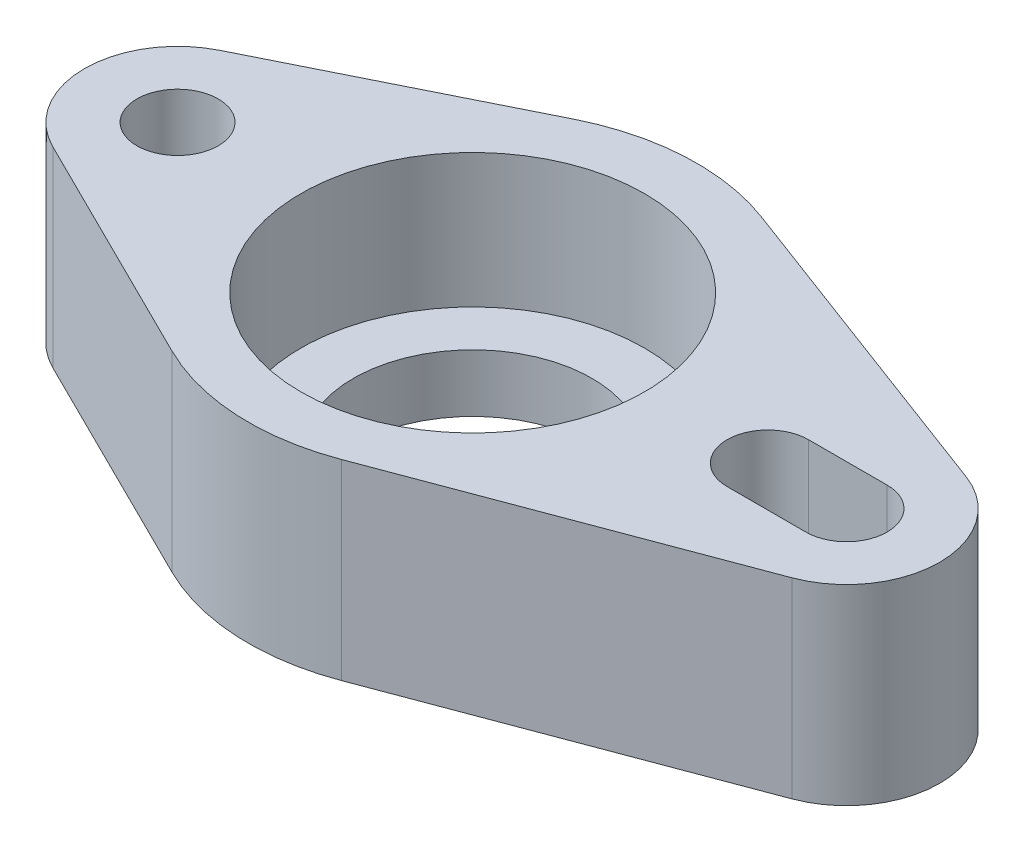
ISO-10303-21;
HEADER;
FILE_DESCRIPTION(('STEP AP214'),'2;1');
FILE_NAME('part.step','',(''),(''),'','','');
FILE_SCHEMA(('AUTOMOTIVE_DESIGN { 1 0 10303 214 1 1 1 1 }'));
ENDSEC;
DATA;
#1=APPLICATION_CONTEXT('core data for automotive mechanical design processes');
#2=APPLICATION_PROTOCOL_DEFINITION('international standard','automotive_design',2000,#1);
#3=PRODUCT_CONTEXT('',#1,'mechanical');
#4=PRODUCT('Part','Part','',(#3));
#5=PRODUCT_RELATED_PRODUCT_CATEGORY('part','',(#4));
#6=PRODUCT_DEFINITION_FORMATION('','',#4);
#7=PRODUCT_DEFINITION_CONTEXT('part definition',#1,'design');
#8=PRODUCT_DEFINITION('design','',#6,#7);
#9=PRODUCT_DEFINITION_SHAPE('','',#8);
#10=(LENGTH_UNIT() NAMED_UNIT(*) SI_UNIT(.MILLI.,.METRE.));
#11=(NAMED_UNIT(*) PLANE_ANGLE_UNIT() SI_UNIT($,.RADIAN.));
#12=(NAMED_UNIT(*) SI_UNIT($,.STERADIAN.) SOLID_ANGLE_UNIT());
#13=UNCERTAINTY_MEASURE_WITH_UNIT(LENGTH_MEASURE(1.E-05),#10,'distance_accuracy_value','');
#14=(GEOMETRIC_REPRESENTATION_CONTEXT(3) GLOBAL_UNCERTAINTY_ASSIGNED_CONTEXT((#13)) GLOBAL_UNIT_ASSIGNED_CONTEXT((#10,
#11,#12)) REPRESENTATION_CONTEXT('',''));
#15=CARTESIAN_POINT('',(0.,0.,0.));
#16=DIRECTION('',(0.,0.,1.));
#17=DIRECTION('',(1.,0.,0.));
#18=AXIS2_PLACEMENT_3D('',#15,#16,#17);
#19=CARTESIAN_POINT('',(3.,7.3,8.00640368704951));
#20=DIRECTION('',(0.350877192982456,0.,0.93642148386544));
#21=DIRECTION('',(0.93642148386544,0.,-0.350877192982456));
#22=AXIS2_PLACEMENT_3D('',#19,#20,#21);
#23=PLANE('',#22);
#24=DIRECTION('',(-0.93642148386544,0.,0.350877192982456));
#25=VECTOR('',#24,1.);
#26=CARTESIAN_POINT('',(3.,0.,8.00640368704951));
#27=LINE('',#26,#25);
#28=CARTESIAN_POINT('',(15.4956140350877,0.,3.32429626772231));
#29=VERTEX_POINT('',#28);
#30=CARTESIAN_POINT('',(3.,0.,8.00640368704951));
#31=VERTEX_POINT('',#30);
#32=EDGE_CURVE('E234',#29,#31,#27,.T.);
#33=ORIENTED_EDGE('',*,*,#32,.F.);
#34=DIRECTION('',(0.,-1.,0.));
#35=VECTOR('',#34,1.);
#36=CARTESIAN_POINT('',(15.4956140350877,7.3,3.32429626772231));
#37=LINE('',#36,#35);
#38=CARTESIAN_POINT('',(15.4956140350877,7.3,3.32429626772231));
#39=VERTEX_POINT('',#38);
#40=EDGE_CURVE('E55',#39,#29,#37,.T.);
#41=ORIENTED_EDGE('',*,*,#40,.F.);
#42=DIRECTION('',(-0.93642148386544,0.,0.350877192982456));
#43=VECTOR('',#42,1.);
#44=CARTESIAN_POINT('',(3.,7.3,8.00640368704951));
#45=LINE('',#44,#43);
#46=CARTESIAN_POINT('',(3.,7.3,8.00640368704951));
#47=VERTEX_POINT('',#46);
#48=EDGE_CURVE('E275',#39,#47,#45,.T.);
#49=ORIENTED_EDGE('',*,*,#48,.T.);
#50=DIRECTION('',(0.,-1.,0.));
#51=VECTOR('',#50,1.);
#52=CARTESIAN_POINT('',(3.,7.3,8.00640368704951));
#53=LINE('',#52,#51);
#54=EDGE_CURVE('E110',#47,#31,#53,.T.);
#55=ORIENTED_EDGE('',*,*,#54,.T.);
#56=EDGE_LOOP('',(#33,#41,#49,#55));
#57=FACE_BOUND('',#56,.T.);
#58=ADVANCED_FACE('F45',(#57),#23,.T.);
#59=CARTESIAN_POINT('',(14.25,7.3,0.));
#60=DIRECTION('',(0.,-1.,0.));
#61=DIRECTION('',(0.,0.,-1.));
#62=AXIS2_PLACEMENT_3D('',#59,#60,#61);
#63=CYLINDRICAL_SURFACE('',#62,3.55);
#64=CARTESIAN_POINT('',(14.25,0.,0.));
#65=DIRECTION('',(0.,1.,0.));
#66=DIRECTION('',(0.,0.,1.));
#67=AXIS2_PLACEMENT_3D('',#64,#65,#66);
#68=CIRCLE('',#67,3.55);
#69=CARTESIAN_POINT('',(15.4956140350877,0.,-3.32429626772231));
#70=VERTEX_POINT('',#69);
#71=EDGE_CURVE('E230',#29,#70,#68,.T.);
#72=ORIENTED_EDGE('',*,*,#71,.T.);
#73=DIRECTION('',(0.,-1.,0.));
#74=VECTOR('',#73,1.);
#75=CARTESIAN_POINT('',(15.4956140350877,7.3,-3.32429626772231));
#76=LINE('',#75,#74);
#77=CARTESIAN_POINT('',(15.4956140350877,7.3,-3.32429626772231));
#78=VERTEX_POINT('',#77);
#79=EDGE_CURVE('E185',#78,#70,#76,.T.);
#80=ORIENTED_EDGE('',*,*,#79,.F.);
#81=CARTESIAN_POINT('',(14.25,7.3,0.));
#82=DIRECTION('',(0.,1.,0.));
#83=DIRECTION('',(0.,0.,1.));
#84=AXIS2_PLACEMENT_3D('',#81,#82,#83);
#85=CIRCLE('',#84,3.55);
#86=EDGE_CURVE('E271',#39,#78,#85,.T.);
#87=ORIENTED_EDGE('',*,*,#86,.F.);
#88=ORIENTED_EDGE('',*,*,#40,.T.);
#89=EDGE_LOOP('',(#72,#80,#87,#88));
#90=FACE_BOUND('',#89,.T.);
#91=ADVANCED_FACE('F339',(#90),#63,.T.);
#92=CARTESIAN_POINT('',(3.,7.3,-8.00640368704951));
#93=DIRECTION('',(-0.350877192982456,0.,0.93642148386544));
#94=DIRECTION('',(0.93642148386544,0.,0.350877192982456));
#95=AXIS2_PLACEMENT_3D('',#92,#93,#94);
#96=PLANE('',#95);
#97=DIRECTION('',(-0.93642148386544,0.,-0.350877192982456));
#98=VECTOR('',#97,1.);
#99=CARTESIAN_POINT('',(3.,0.,-8.00640368704951));
#100=LINE('',#99,#98);
#101=CARTESIAN_POINT('',(3.,0.,-8.00640368704951));
#102=VERTEX_POINT('',#101);
#103=EDGE_CURVE('E226',#70,#102,#100,.T.);
#104=ORIENTED_EDGE('',*,*,#103,.T.);
#105=DIRECTION('',(0.,-1.,0.));
#106=VECTOR('',#105,1.);
#107=CARTESIAN_POINT('',(3.,7.3,-8.00640368704951));
#108=LINE('',#107,#106);
#109=CARTESIAN_POINT('',(3.,7.3,-8.00640368704951));
#110=VERTEX_POINT('',#109);
#111=EDGE_CURVE('E181',#110,#102,#108,.T.);
#112=ORIENTED_EDGE('',*,*,#111,.F.);
#113=DIRECTION('',(-0.93642148386544,0.,-0.350877192982456));
#114=VECTOR('',#113,1.);
#115=CARTESIAN_POINT('',(3.,7.3,-8.00640368704951));
#116=LINE('',#115,#114);
#117=EDGE_CURVE('E267',#78,#110,#116,.T.);
#118=ORIENTED_EDGE('',*,*,#117,.F.);
#119=ORIENTED_EDGE('',*,*,#79,.T.);
#120=EDGE_LOOP('',(#104,#112,#118,#119));
#121=FACE_BOUND('',#120,.T.);
#122=ADVANCED_FACE('F344',(#121),#96,.F.);
#123=CARTESIAN_POINT('',(0.,7.3,0.));
#124=DIRECTION('',(0.,-1.,0.));
#125=DIRECTION('',(0.,0.,-1.));
#126=AXIS2_PLACEMENT_3D('',#123,#124,#125);
#127=CYLINDRICAL_SURFACE('',#126,8.55);
#128=CARTESIAN_POINT('',(0.,0.,0.));
#129=DIRECTION('',(0.,1.,0.));
#130=DIRECTION('',(0.,0.,1.));
#131=AXIS2_PLACEMENT_3D('',#128,#129,#130);
#132=CIRCLE('',#131,8.55);
#133=CARTESIAN_POINT('',(-3.8,0.,-7.65914486088362));
#134=VERTEX_POINT('',#133);
#135=EDGE_CURVE('E222',#102,#134,#132,.T.);
#136=ORIENTED_EDGE('',*,*,#135,.T.);
#137=DIRECTION('',(0.,-1.,0.));
#138=VECTOR('',#137,1.);
#139=CARTESIAN_POINT('',(-3.8,7.3,-7.65914486088362));
#140=LINE('',#139,#138);
#141=CARTESIAN_POINT('',(-3.8,7.3,-7.65914486088362));
#142=VERTEX_POINT('',#141);
#143=EDGE_CURVE('E174',#142,#134,#140,.T.);
#144=ORIENTED_EDGE('',*,*,#143,.F.);
#145=CARTESIAN_POINT('',(0.,7.3,0.));
#146=DIRECTION('',(0.,1.,0.));
#147=DIRECTION('',(0.,0.,1.));
#148=AXIS2_PLACEMENT_3D('',#145,#146,#147);
#149=CIRCLE('',#148,8.55);
#150=EDGE_CURVE('E264',#110,#142,#149,.T.);
#151=ORIENTED_EDGE('',*,*,#150,.F.);
#152=ORIENTED_EDGE('',*,*,#111,.T.);
#153=EDGE_LOOP('',(#136,#144,#151,#152));
#154=FACE_BOUND('',#153,.T.);
#155=ADVANCED_FACE('F372',(#154),#127,.T.);
#156=CARTESIAN_POINT('',(-3.8,7.3,-7.65914486088362));
#157=DIRECTION('',(-0.444444444444444,0.,-0.895806416477617));
#158=DIRECTION('',(-0.895806416477617,0.,0.444444444444444));
#159=AXIS2_PLACEMENT_3D('',#156,#157,#158);
#160=PLANE('',#159);
#161=DIRECTION('',(0.895806416477617,0.,-0.444444444444444));
#162=VECTOR('',#161,1.);
#163=CARTESIAN_POINT('',(-3.8,0.,-7.65914486088362));
#164=LINE('',#163,#162);
#165=CARTESIAN_POINT('',(-12.8277777777778,0.,-3.18011277849554));
#166=VERTEX_POINT('',#165);
#167=EDGE_CURVE('E218',#166,#134,#164,.T.);
#168=ORIENTED_EDGE('',*,*,#167,.F.);
#169=DIRECTION('',(0.,-1.,0.));
#170=VECTOR('',#169,1.);
#171=CARTESIAN_POINT('',(-12.8277777777778,7.3,-3.18011277849554));
#172=LINE('',#171,#170);
#173=CARTESIAN_POINT('',(-12.8277777777778,7.3,-3.18011277849554));
#174=VERTEX_POINT('',#173);
#175=EDGE_CURVE('E170',#174,#166,#172,.T.);
#176=ORIENTED_EDGE('',*,*,#175,.F.);
#177=DIRECTION('',(0.895806416477617,0.,-0.444444444444444));
#178=VECTOR('',#177,1.);
#179=CARTESIAN_POINT('',(-3.8,7.3,-7.65914486088362));
#180=LINE('',#179,#178);
#181=EDGE_CURVE('E162',#174,#142,#180,.T.);
#182=ORIENTED_EDGE('',*,*,#181,.T.);
#183=ORIENTED_EDGE('',*,*,#143,.T.);
#184=EDGE_LOOP('',(#168,#176,#182,#183));
#185=FACE_BOUND('',#184,.T.);
#186=ADVANCED_FACE('F375',(#185),#160,.T.);
#187=CARTESIAN_POINT('',(-11.25,7.3,0.));
#188=DIRECTION('',(0.,-1.,0.));
#189=DIRECTION('',(0.,0.,-1.));
#190=AXIS2_PLACEMENT_3D('',#187,#188,#189);
#191=CYLINDRICAL_SURFACE('',#190,3.55);
#192=CARTESIAN_POINT('',(-11.25,0.,0.));
#193=DIRECTION('',(0.,1.,0.));
#194=DIRECTION('',(0.,0.,1.));
#195=AXIS2_PLACEMENT_3D('',#192,#193,#194);
#196=CIRCLE('',#195,3.55);
#197=CARTESIAN_POINT('',(-12.8277777777778,0.,3.18011277849554));
#198=VERTEX_POINT('',#197);
#199=EDGE_CURVE('E168',#166,#198,#196,.T.);
#200=ORIENTED_EDGE('',*,*,#199,.T.);
#201=DIRECTION('',(0.,-1.,0.));
#202=VECTOR('',#201,1.);
#203=CARTESIAN_POINT('',(-12.8277777777778,7.3,3.18011277849554));
#204=LINE('',#203,#202);
#205=CARTESIAN_POINT('',(-12.8277777777778,7.3,3.18011277849554));
#206=VERTEX_POINT('',#205);
#207=EDGE_CURVE('E151',#206,#198,#204,.T.);
#208=ORIENTED_EDGE('',*,*,#207,.F.);
#209=CARTESIAN_POINT('',(-11.25,7.3,0.));
#210=DIRECTION('',(0.,1.,0.));
#211=DIRECTION('',(0.,0.,1.));
#212=AXIS2_PLACEMENT_3D('',#209,#210,#211);
#213=CIRCLE('',#212,3.55);
#214=EDGE_CURVE('E155',#174,#206,#213,.T.);
#215=ORIENTED_EDGE('',*,*,#214,.F.);
#216=ORIENTED_EDGE('',*,*,#175,.T.);
#217=EDGE_LOOP('',(#200,#208,#215,#216));
#218=FACE_BOUND('',#217,.T.);
#219=ADVANCED_FACE('F166',(#218),#191,.T.);
#220=CARTESIAN_POINT('',(-3.8,7.3,7.65914486088362));
#221=DIRECTION('',(0.444444444444444,0.,-0.895806416477617));
#222=DIRECTION('',(-0.895806416477617,0.,-0.444444444444444));
#223=AXIS2_PLACEMENT_3D('',#220,#221,#222);
#224=PLANE('',#223);
#225=DIRECTION('',(0.895806416477617,0.,0.444444444444444));
#226=VECTOR('',#225,1.);
#227=CARTESIAN_POINT('',(-3.8,0.,7.65914486088362));
#228=LINE('',#227,#226);
#229=CARTESIAN_POINT('',(-3.8,0.,7.65914486088362));
#230=VERTEX_POINT('',#229);
#231=EDGE_CURVE('E213',#198,#230,#228,.T.);
#232=ORIENTED_EDGE('',*,*,#231,.T.);
#233=DIRECTION('',(0.,-1.,0.));
#234=VECTOR('',#233,1.);
#235=CARTESIAN_POINT('',(-3.8,7.3,7.65914486088362));
#236=LINE('',#235,#234);
#237=CARTESIAN_POINT('',(-3.8,7.3,7.65914486088362));
#238=VERTEX_POINT('',#237);
#239=EDGE_CURVE('E153',#238,#230,#236,.T.);
#240=ORIENTED_EDGE('',*,*,#239,.F.);
#241=DIRECTION('',(0.895806416477617,0.,0.444444444444444));
#242=VECTOR('',#241,1.);
#243=CARTESIAN_POINT('',(-3.8,7.3,7.65914486088362));
#244=LINE('',#243,#242);
#245=EDGE_CURVE('E146',#206,#238,#244,.T.);
#246=ORIENTED_EDGE('',*,*,#245,.F.);
#247=ORIENTED_EDGE('',*,*,#207,.T.);
#248=EDGE_LOOP('',(#232,#240,#246,#247));
#249=FACE_BOUND('',#248,.T.);
#250=ADVANCED_FACE('F149',(#249),#224,.F.);
#251=CARTESIAN_POINT('',(11.25,7.3,0.));
#252=DIRECTION('',(0.,-1.,0.));
#253=DIRECTION('',(0.,0.,-1.));
#254=AXIS2_PLACEMENT_3D('',#251,#252,#253);
#255=CYLINDRICAL_SURFACE('',#254,1.55);
#256=CARTESIAN_POINT('',(11.25,0.,0.));
#257=DIRECTION('',(0.,1.,0.));
#258=DIRECTION('',(0.,0.,1.));
#259=AXIS2_PLACEMENT_3D('',#256,#257,#258);
#260=CIRCLE('',#259,1.55);
#261=CARTESIAN_POINT('',(11.25,0.,-1.55));
#262=VERTEX_POINT('',#261);
#263=CARTESIAN_POINT('',(11.25,0.,1.55));
#264=VERTEX_POINT('',#263);
#265=EDGE_CURVE('E248',#262,#264,#260,.T.);
#266=ORIENTED_EDGE('',*,*,#265,.F.);
#267=DIRECTION('',(0.,-1.,0.));
#268=VECTOR('',#267,1.);
#269=CARTESIAN_POINT('',(11.25,7.3,-1.55));
#270=LINE('',#269,#268);
#271=CARTESIAN_POINT('',(11.25,7.3,-1.55));
#272=VERTEX_POINT('',#271);
#273=EDGE_CURVE('E117',#272,#262,#270,.T.);
#274=ORIENTED_EDGE('',*,*,#273,.F.);
#275=CARTESIAN_POINT('',(11.25,7.3,0.));
#276=DIRECTION('',(0.,1.,0.));
#277=DIRECTION('',(0.,0.,1.));
#278=AXIS2_PLACEMENT_3D('',#275,#276,#277);
#279=CIRCLE('',#278,1.55);
#280=CARTESIAN_POINT('',(11.25,7.3,1.55));
#281=VERTEX_POINT('',#280);
#282=EDGE_CURVE('E210',#272,#281,#279,.T.);
#283=ORIENTED_EDGE('',*,*,#282,.T.);
#284=DIRECTION('',(0.,-1.,0.));
#285=VECTOR('',#284,1.);
#286=CARTESIAN_POINT('',(11.25,7.3,1.55));
#287=LINE('',#286,#285);
#288=EDGE_CURVE('E191',#281,#264,#287,.T.);
#289=ORIENTED_EDGE('',*,*,#288,.T.);
#290=EDGE_LOOP('',(#266,#274,#283,#289));
#291=FACE_BOUND('',#290,.T.);
#292=ADVANCED_FACE('F47',(#291),#255,.F.);
#293=CARTESIAN_POINT('',(0.,7.3,-1.55));
#294=DIRECTION('',(0.,0.,-1.));
#295=DIRECTION('',(-1.,0.,0.));
#296=AXIS2_PLACEMENT_3D('',#293,#294,#295);
#297=PLANE('',#296);
#298=DIRECTION('',(1.,0.,0.));
#299=VECTOR('',#298,1.);
#300=CARTESIAN_POINT('',(0.,0.,-1.55));
#301=LINE('',#300,#299);
#302=CARTESIAN_POINT('',(14.25,0.,-1.55));
#303=VERTEX_POINT('',#302);
#304=EDGE_CURVE('E245',#262,#303,#301,.T.);
#305=ORIENTED_EDGE('',*,*,#304,.T.);
#306=DIRECTION('',(0.,-1.,0.));
#307=VECTOR('',#306,1.);
#308=CARTESIAN_POINT('',(14.25,7.3,-1.55));
#309=LINE('',#308,#307);
#310=CARTESIAN_POINT('',(14.25,7.3,-1.55));
#311=VERTEX_POINT('',#310);
#312=EDGE_CURVE('E198',#311,#303,#309,.T.);
#313=ORIENTED_EDGE('',*,*,#312,.F.);
#314=DIRECTION('',(1.,0.,0.));
#315=VECTOR('',#314,1.);
#316=CARTESIAN_POINT('',(0.,7.3,-1.55));
#317=LINE('',#316,#315);
#318=EDGE_CURVE('E286',#272,#311,#317,.T.);
#319=ORIENTED_EDGE('',*,*,#318,.F.);
#320=ORIENTED_EDGE('',*,*,#273,.T.);
#321=EDGE_LOOP('',(#305,#313,#319,#320));
#322=FACE_BOUND('',#321,.T.);
#323=ADVANCED_FACE('F353',(#322),#297,.F.);
#324=CARTESIAN_POINT('',(14.25,7.3,0.));
#325=DIRECTION('',(0.,-1.,0.));
#326=DIRECTION('',(0.,0.,-1.));
#327=AXIS2_PLACEMENT_3D('',#324,#325,#326);
#328=CYLINDRICAL_SURFACE('',#327,1.55);
#329=CARTESIAN_POINT('',(14.25,0.,0.));
#330=DIRECTION('',(0.,1.,0.));
#331=DIRECTION('',(0.,0.,1.));
#332=AXIS2_PLACEMENT_3D('',#329,#330,#331);
#333=CIRCLE('',#332,1.55);
#334=CARTESIAN_POINT('',(14.25,0.,1.55));
#335=VERTEX_POINT('',#334);
#336=EDGE_CURVE('E241',#335,#303,#333,.T.);
#337=ORIENTED_EDGE('',*,*,#336,.F.);
#338=DIRECTION('',(0.,-1.,0.));
#339=VECTOR('',#338,1.);
#340=CARTESIAN_POINT('',(14.25,7.3,1.55));
#341=LINE('',#340,#339);
#342=CARTESIAN_POINT('',(14.25,7.3,1.55));
#343=VERTEX_POINT('',#342);
#344=EDGE_CURVE('E194',#343,#335,#341,.T.);
#345=ORIENTED_EDGE('',*,*,#344,.F.);
#346=CARTESIAN_POINT('',(14.25,7.3,0.));
#347=DIRECTION('',(0.,1.,0.));
#348=DIRECTION('',(0.,0.,1.));
#349=AXIS2_PLACEMENT_3D('',#346,#347,#348);
#350=CIRCLE('',#349,1.55);
#351=EDGE_CURVE('E282',#343,#311,#350,.T.);
#352=ORIENTED_EDGE('',*,*,#351,.T.);
#353=ORIENTED_EDGE('',*,*,#312,.T.);
#354=EDGE_LOOP('',(#337,#345,#352,#353));
#355=FACE_BOUND('',#354,.T.);
#356=ADVANCED_FACE('F312',(#355),#328,.F.);
#357=CARTESIAN_POINT('',(0.,7.3,0.));
#358=DIRECTION('',(0.,-1.,0.));
#359=DIRECTION('',(0.,0.,-1.));
#360=AXIS2_PLACEMENT_3D('',#357,#358,#359);
#361=CYLINDRICAL_SURFACE('',#360,6.55);
#362=CARTESIAN_POINT('',(0.,2.2,0.));
#363=DIRECTION('',(0.,1.,0.));
#364=DIRECTION('',(0.,0.,1.));
#365=AXIS2_PLACEMENT_3D('',#362,#363,#364);
#366=CIRCLE('',#365,6.55);
#367=CARTESIAN_POINT('',(0.,2.2,6.55));
#368=VERTEX_POINT('',#367);
#369=EDGE_CURVE('E11',#368,#368,#366,.T.);
#370=ORIENTED_EDGE('',*,*,#369,.F.);
#371=EDGE_LOOP('',(#370));
#372=FACE_BOUND('',#371,.T.);
#373=CARTESIAN_POINT('',(0.,7.3,0.));
#374=DIRECTION('',(0.,1.,0.));
#375=DIRECTION('',(0.,0.,1.));
#376=AXIS2_PLACEMENT_3D('',#373,#374,#375);
#377=CIRCLE('',#376,6.55);
#378=CARTESIAN_POINT('',(0.,7.3,6.55));
#379=VERTEX_POINT('',#378);
#380=EDGE_CURVE('E256',#379,#379,#377,.T.);
#381=ORIENTED_EDGE('',*,*,#380,.T.);
#382=EDGE_LOOP('',(#381));
#383=FACE_BOUND('',#382,.T.);
#384=ADVANCED_FACE('F308',(#372,#383),#361,.F.);
#385=CARTESIAN_POINT('',(0.,7.3,0.));
#386=DIRECTION('',(0.,-1.,0.));
#387=DIRECTION('',(0.,0.,-1.));
#388=AXIS2_PLACEMENT_3D('',#385,#386,#387);
#389=CYLINDRICAL_SURFACE('',#388,8.55);
#390=CARTESIAN_POINT('',(0.,0.,0.));
#391=DIRECTION('',(0.,1.,0.));
#392=DIRECTION('',(0.,0.,1.));
#393=AXIS2_PLACEMENT_3D('',#390,#391,#392);
#394=CIRCLE('',#393,8.55);
#395=EDGE_CURVE('E103',#230,#31,#394,.T.);
#396=ORIENTED_EDGE('',*,*,#395,.T.);
#397=ORIENTED_EDGE('',*,*,#54,.F.);
#398=CARTESIAN_POINT('',(0.,7.3,0.));
#399=DIRECTION('',(0.,1.,0.));
#400=DIRECTION('',(0.,0.,1.));
#401=AXIS2_PLACEMENT_3D('',#398,#399,#400);
#402=CIRCLE('',#401,8.55);
#403=EDGE_CURVE('E63',#238,#47,#402,.T.);
#404=ORIENTED_EDGE('',*,*,#403,.F.);
#405=ORIENTED_EDGE('',*,*,#239,.T.);
#406=EDGE_LOOP('',(#396,#397,#404,#405));
#407=FACE_BOUND('',#406,.T.);
#408=ADVANCED_FACE('F311',(#407),#389,.T.);
#409=CARTESIAN_POINT('',(0.,7.3,1.55));
#410=DIRECTION('',(0.,0.,-1.));
#411=DIRECTION('',(-1.,0.,0.));
#412=AXIS2_PLACEMENT_3D('',#409,#410,#411);
#413=PLANE('',#412);
#414=DIRECTION('',(1.,0.,0.));
#415=VECTOR('',#414,1.);
#416=CARTESIAN_POINT('',(0.,0.,1.55));
#417=LINE('',#416,#415);
#418=EDGE_CURVE('E237',#264,#335,#417,.T.);
#419=ORIENTED_EDGE('',*,*,#418,.F.);
#420=ORIENTED_EDGE('',*,*,#288,.F.);
#421=DIRECTION('',(1.,0.,0.));
#422=VECTOR('',#421,1.);
#423=CARTESIAN_POINT('',(0.,7.3,1.55));
#424=LINE('',#423,#422);
#425=EDGE_CURVE('E278',#281,#343,#424,.T.);
#426=ORIENTED_EDGE('',*,*,#425,.T.);
#427=ORIENTED_EDGE('',*,*,#344,.T.);
#428=EDGE_LOOP('',(#419,#420,#426,#427));
#429=FACE_BOUND('',#428,.T.);
#430=ADVANCED_FACE('F325',(#429),#413,.T.);
#431=CARTESIAN_POINT('',(-11.25,7.3,0.));
#432=DIRECTION('',(0.,-1.,0.));
#433=DIRECTION('',(0.,0.,-1.));
#434=AXIS2_PLACEMENT_3D('',#431,#432,#433);
#435=CYLINDRICAL_SURFACE('',#434,1.55);
#436=CARTESIAN_POINT('',(-11.25,7.3,0.));
#437=DIRECTION('',(0.,1.,0.));
#438=DIRECTION('',(0.,0.,1.));
#439=AXIS2_PLACEMENT_3D('',#436,#437,#438);
#440=CIRCLE('',#439,1.55);
#441=CARTESIAN_POINT('',(-11.25,7.3,1.55));
#442=VERTEX_POINT('',#441);
#443=EDGE_CURVE('E195',#442,#442,#440,.T.);
#444=ORIENTED_EDGE('',*,*,#443,.T.);
#445=EDGE_LOOP('',(#444));
#446=FACE_BOUND('',#445,.T.);
#447=CARTESIAN_POINT('',(-11.25,0.,0.));
#448=DIRECTION('',(0.,1.,0.));
#449=DIRECTION('',(0.,0.,1.));
#450=AXIS2_PLACEMENT_3D('',#447,#448,#449);
#451=CIRCLE('',#450,1.55);
#452=CARTESIAN_POINT('',(-11.25,0.,1.55));
#453=VERTEX_POINT('',#452);
#454=EDGE_CURVE('E206',#453,#453,#451,.T.);
#455=ORIENTED_EDGE('',*,*,#454,.F.);
#456=EDGE_LOOP('',(#455));
#457=FACE_BOUND('',#456,.T.);
#458=ADVANCED_FACE('F318',(#446,#457),#435,.F.);
#459=CARTESIAN_POINT('',(0.,7.3,0.));
#460=DIRECTION('',(0.,1.,0.));
#461=DIRECTION('',(0.,0.,1.));
#462=AXIS2_PLACEMENT_3D('',#459,#460,#461);
#463=PLANE('',#462);
#464=ORIENTED_EDGE('',*,*,#282,.F.);
#465=ORIENTED_EDGE('',*,*,#318,.T.);
#466=ORIENTED_EDGE('',*,*,#351,.F.);
#467=ORIENTED_EDGE('',*,*,#425,.F.);
#468=EDGE_LOOP('',(#464,#465,#466,#467));
#469=FACE_BOUND('',#468,.T.);
#470=ORIENTED_EDGE('',*,*,#48,.F.);
#471=ORIENTED_EDGE('',*,*,#86,.T.);
#472=ORIENTED_EDGE('',*,*,#117,.T.);
#473=ORIENTED_EDGE('',*,*,#150,.T.);
#474=ORIENTED_EDGE('',*,*,#181,.F.);
#475=ORIENTED_EDGE('',*,*,#214,.T.);
#476=ORIENTED_EDGE('',*,*,#245,.T.);
#477=ORIENTED_EDGE('',*,*,#403,.T.);
#478=EDGE_LOOP('',(#470,#471,#472,#473,#474,#475,#476,#477));
#479=FACE_BOUND('',#478,.T.);
#480=ORIENTED_EDGE('',*,*,#380,.F.);
#481=EDGE_LOOP('',(#480));
#482=FACE_BOUND('',#481,.T.);
#483=ORIENTED_EDGE('',*,*,#443,.F.);
#484=EDGE_LOOP('',(#483));
#485=FACE_BOUND('',#484,.T.);
#486=ADVANCED_FACE('F159',(#469,#479,#482,#485),#463,.T.);
#487=CARTESIAN_POINT('',(0.,0.,0.));
#488=DIRECTION('',(0.,1.,0.));
#489=DIRECTION('',(0.,0.,1.));
#490=AXIS2_PLACEMENT_3D('',#487,#488,#489);
#491=PLANE('',#490);
#492=ORIENTED_EDGE('',*,*,#265,.T.);
#493=ORIENTED_EDGE('',*,*,#418,.T.);
#494=ORIENTED_EDGE('',*,*,#336,.T.);
#495=ORIENTED_EDGE('',*,*,#304,.F.);
#496=EDGE_LOOP('',(#492,#493,#494,#495));
#497=FACE_BOUND('',#496,.T.);
#498=ORIENTED_EDGE('',*,*,#32,.T.);
#499=ORIENTED_EDGE('',*,*,#395,.F.);
#500=ORIENTED_EDGE('',*,*,#231,.F.);
#501=ORIENTED_EDGE('',*,*,#199,.F.);
#502=ORIENTED_EDGE('',*,*,#167,.T.);
#503=ORIENTED_EDGE('',*,*,#135,.F.);
#504=ORIENTED_EDGE('',*,*,#103,.F.);
#505=ORIENTED_EDGE('',*,*,#71,.F.);
#506=EDGE_LOOP('',(#498,#499,#500,#501,#502,#503,#504,#505));
#507=FACE_BOUND('',#506,.T.);
#508=ORIENTED_EDGE('',*,*,#454,.T.);
#509=EDGE_LOOP('',(#508));
#510=FACE_BOUND('',#509,.T.);
#511=CARTESIAN_POINT('',(0.,0.,0.));
#512=DIRECTION('',(0.,1.,0.));
#513=DIRECTION('',(0.,0.,1.));
#514=AXIS2_PLACEMENT_3D('',#511,#512,#513);
#515=CIRCLE('',#514,4.55);
#516=CARTESIAN_POINT('',(0.,0.,4.55));
#517=VERTEX_POINT('',#516);
#518=EDGE_CURVE('E291',#517,#517,#515,.T.);
#519=ORIENTED_EDGE('',*,*,#518,.T.);
#520=EDGE_LOOP('',(#519));
#521=FACE_BOUND('',#520,.T.);
#522=ADVANCED_FACE('F317',(#497,#507,#510,#521),#491,.F.);
#523=CARTESIAN_POINT('',(0.,2.2,0.));
#524=DIRECTION('',(0.,-1.,0.));
#525=DIRECTION('',(0.,0.,-1.));
#526=AXIS2_PLACEMENT_3D('',#523,#524,#525);
#527=CYLINDRICAL_SURFACE('',#526,4.55);
#528=CARTESIAN_POINT('',(0.,2.2,0.));
#529=DIRECTION('',(0.,1.,0.));
#530=DIRECTION('',(0.,0.,1.));
#531=AXIS2_PLACEMENT_3D('',#528,#529,#530);
#532=CIRCLE('',#531,4.55);
#533=CARTESIAN_POINT('',(0.,2.2,4.55));
#534=VERTEX_POINT('',#533);
#535=EDGE_CURVE('E252',#534,#534,#532,.T.);
#536=ORIENTED_EDGE('',*,*,#535,.T.);
#537=EDGE_LOOP('',(#536));
#538=FACE_BOUND('',#537,.T.);
#539=ORIENTED_EDGE('',*,*,#518,.F.);
#540=EDGE_LOOP('',(#539));
#541=FACE_BOUND('',#540,.T.);
#542=ADVANCED_FACE('F299',(#538,#541),#527,.F.);
#543=CARTESIAN_POINT('',(0.,2.2,0.));
#544=DIRECTION('',(0.,1.,0.));
#545=DIRECTION('',(0.,0.,1.));
#546=AXIS2_PLACEMENT_3D('',#543,#544,#545);
#547=PLANE('',#546);
#548=ORIENTED_EDGE('',*,*,#535,.F.);
#549=EDGE_LOOP('',(#548));
#550=FACE_BOUND('',#549,.T.);
#551=ORIENTED_EDGE('',*,*,#369,.T.);
#552=EDGE_LOOP('',(#551));
#553=FACE_BOUND('',#552,.T.);
#554=ADVANCED_FACE('F302',(#550,#553),#547,.T.);
#555=CLOSED_SHELL('',(#58,#91,#122,#155,#186,#219,#250,#292,#323,#356,#384,#408,#430,#458,#486,
#522,#542,#554));
#556=MANIFOLD_SOLID_BREP('B2',#555);
#557=ADVANCED_BREP_SHAPE_REPRESENTATION('',(#18,#556),#14);
#558=SHAPE_DEFINITION_REPRESENTATION(#9,#557);
ENDSEC;
END-ISO-10303-21;
